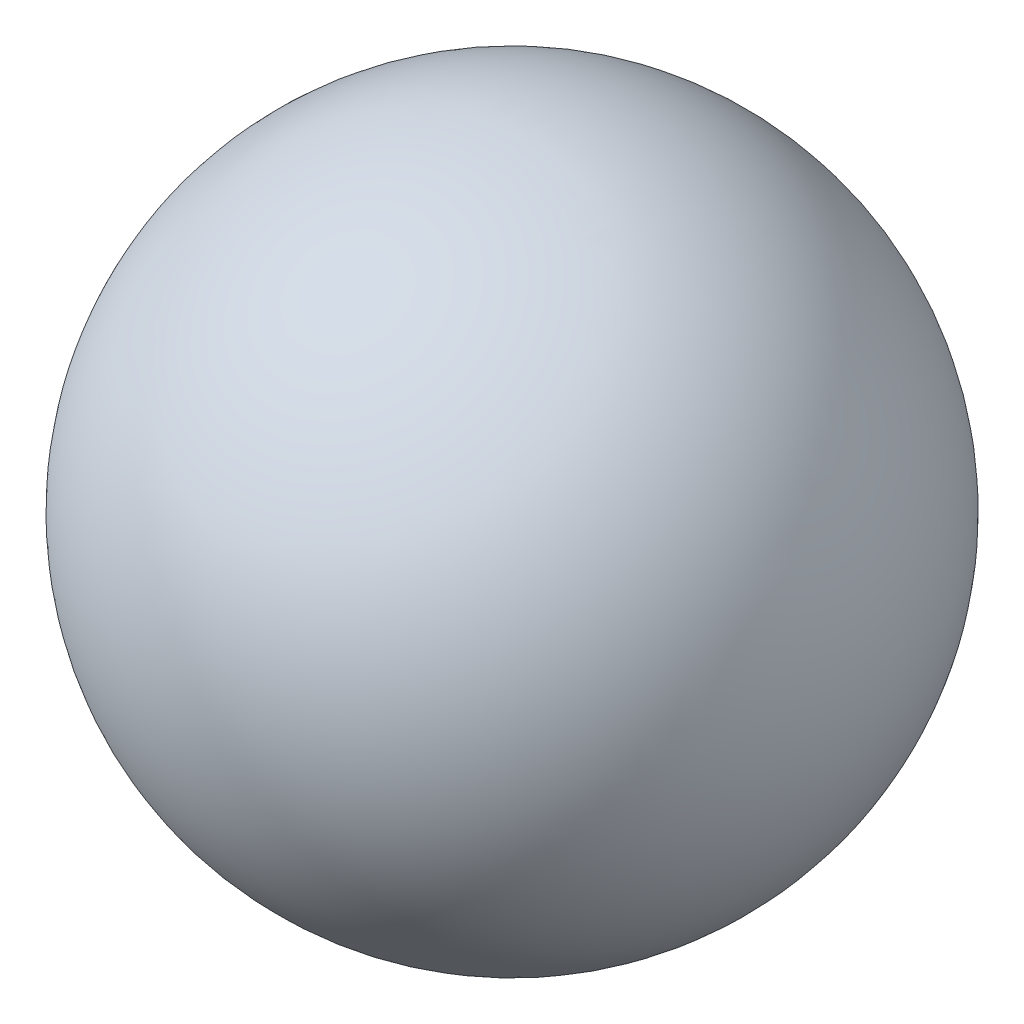
ISO-10303-21;
HEADER;
FILE_DESCRIPTION(('STEP AP214'),'2;1');
FILE_NAME('part.step','',(''),(''),'','','');
FILE_SCHEMA(('AUTOMOTIVE_DESIGN { 1 0 10303 214 1 1 1 1 }'));
ENDSEC;
DATA;
#1=APPLICATION_CONTEXT('core data for automotive mechanical design processes');
#2=APPLICATION_PROTOCOL_DEFINITION('international standard','automotive_design',2000,#1);
#3=PRODUCT_CONTEXT('',#1,'mechanical');
#4=PRODUCT('Part','Part','',(#3));
#5=PRODUCT_RELATED_PRODUCT_CATEGORY('part','',(#4));
#6=PRODUCT_DEFINITION_FORMATION('','',#4);
#7=PRODUCT_DEFINITION_CONTEXT('part definition',#1,'design');
#8=PRODUCT_DEFINITION('design','',#6,#7);
#9=PRODUCT_DEFINITION_SHAPE('','',#8);
#10=(LENGTH_UNIT() NAMED_UNIT(*) SI_UNIT(.MILLI.,.METRE.));
#11=(NAMED_UNIT(*) PLANE_ANGLE_UNIT() SI_UNIT($,.RADIAN.));
#12=(NAMED_UNIT(*) SI_UNIT($,.STERADIAN.) SOLID_ANGLE_UNIT());
#13=UNCERTAINTY_MEASURE_WITH_UNIT(LENGTH_MEASURE(1.E-05),#10,'distance_accuracy_value','');
#14=(GEOMETRIC_REPRESENTATION_CONTEXT(3) GLOBAL_UNCERTAINTY_ASSIGNED_CONTEXT((#13)) GLOBAL_UNIT_ASSIGNED_CONTEXT((#10,
#11,#12)) REPRESENTATION_CONTEXT('',''));
#15=CARTESIAN_POINT('',(0.,0.,0.));
#16=DIRECTION('',(0.,0.,1.));
#17=DIRECTION('',(1.,0.,0.));
#18=AXIS2_PLACEMENT_3D('',#15,#16,#17);
#19=CARTESIAN_POINT('',(0.,0.,0.));
#20=DIRECTION('',(1.,0.,0.));
#21=DIRECTION('',(0.,1.,0.));
#22=AXIS2_PLACEMENT_3D('',#19,#20,#21);
#23=SPHERICAL_SURFACE('',#22,0.15999968);
#24=CARTESIAN_POINT('',(-0.15999968,0.,0.));
#25=VERTEX_POINT('',#24);
#26=VERTEX_LOOP('',#25);
#27=FACE_BOUND('',#26,.T.);
#28=CARTESIAN_POINT('',(0.15999968,0.,0.));
#29=VERTEX_POINT('',#28);
#30=VERTEX_LOOP('',#29);
#31=FACE_BOUND('',#30,.T.);
#32=ADVANCED_FACE('F16',(#27,#31),#23,.T.);
#33=CLOSED_SHELL('',(#32));
#34=MANIFOLD_SOLID_BREP('B1',#33);
#35=ADVANCED_BREP_SHAPE_REPRESENTATION('',(#18,#34),#14);
#36=SHAPE_DEFINITION_REPRESENTATION(#9,#35);
ENDSEC;
END-ISO-10303-21;
